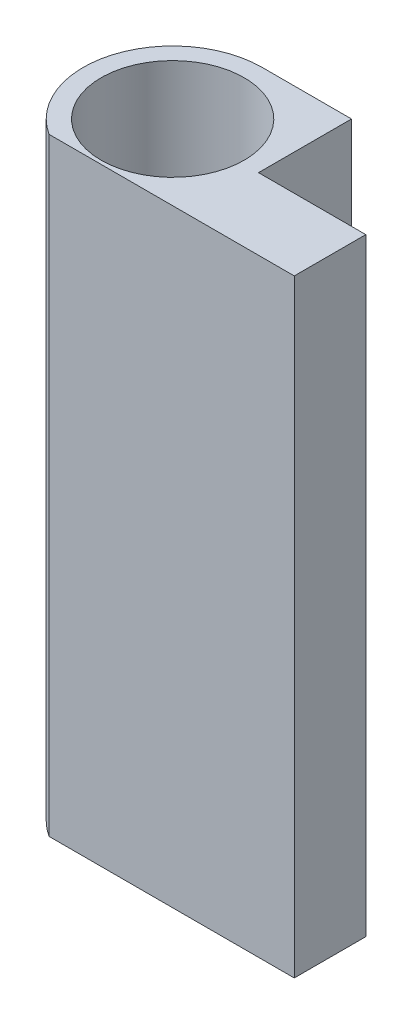
ISO-10303-21;
HEADER;
FILE_DESCRIPTION(('STEP AP214'),'2;1');
FILE_NAME('part.step','',(''),(''),'','','');
FILE_SCHEMA(('AUTOMOTIVE_DESIGN { 1 0 10303 214 1 1 1 1 }'));
ENDSEC;
DATA;
#1=APPLICATION_CONTEXT('core data for automotive mechanical design processes');
#2=APPLICATION_PROTOCOL_DEFINITION('international standard','automotive_design',2000,#1);
#3=PRODUCT_CONTEXT('',#1,'mechanical');
#4=PRODUCT('Part','Part','',(#3));
#5=PRODUCT_RELATED_PRODUCT_CATEGORY('part','',(#4));
#6=PRODUCT_DEFINITION_FORMATION('','',#4);
#7=PRODUCT_DEFINITION_CONTEXT('part definition',#1,'design');
#8=PRODUCT_DEFINITION('design','',#6,#7);
#9=PRODUCT_DEFINITION_SHAPE('','',#8);
#10=(LENGTH_UNIT() NAMED_UNIT(*) SI_UNIT(.MILLI.,.METRE.));
#11=(NAMED_UNIT(*) PLANE_ANGLE_UNIT() SI_UNIT($,.RADIAN.));
#12=(NAMED_UNIT(*) SI_UNIT($,.STERADIAN.) SOLID_ANGLE_UNIT());
#13=UNCERTAINTY_MEASURE_WITH_UNIT(LENGTH_MEASURE(1.E-05),#10,'distance_accuracy_value','');
#14=(GEOMETRIC_REPRESENTATION_CONTEXT(3) GLOBAL_UNCERTAINTY_ASSIGNED_CONTEXT((#13)) GLOBAL_UNIT_ASSIGNED_CONTEXT((#10,
#11,#12)) REPRESENTATION_CONTEXT('',''));
#15=CARTESIAN_POINT('',(0.,0.,0.));
#16=DIRECTION('',(0.,0.,1.));
#17=DIRECTION('',(1.,0.,0.));
#18=AXIS2_PLACEMENT_3D('',#15,#16,#17);
#19=CARTESIAN_POINT('',(0.,-10.,10.));
#20=DIRECTION('',(0.,0.,-1.));
#21=DIRECTION('',(-1.,0.,0.));
#22=AXIS2_PLACEMENT_3D('',#19,#20,#21);
#23=PLANE('',#22);
#24=DIRECTION('',(-1.,0.,0.));
#25=VECTOR('',#24,1.);
#26=CARTESIAN_POINT('',(0.,7.,10.));
#27=LINE('',#26,#25);
#28=CARTESIAN_POINT('',(10.,7.,10.));
#29=VERTEX_POINT('',#28);
#30=CARTESIAN_POINT('',(7.5,7.,10.));
#31=VERTEX_POINT('',#30);
#32=EDGE_CURVE('E82',#29,#31,#27,.T.);
#33=ORIENTED_EDGE('',*,*,#32,.F.);
#34=DIRECTION('',(0.,1.,0.));
#35=VECTOR('',#34,1.);
#36=CARTESIAN_POINT('',(10.,-10.,10.));
#37=LINE('',#36,#35);
#38=CARTESIAN_POINT('',(10.,-10.,10.));
#39=VERTEX_POINT('',#38);
#40=EDGE_CURVE('E11',#39,#29,#37,.T.);
#41=ORIENTED_EDGE('',*,*,#40,.F.);
#42=DIRECTION('',(-1.,0.,0.));
#43=VECTOR('',#42,1.);
#44=CARTESIAN_POINT('',(0.,-10.,10.));
#45=LINE('',#44,#43);
#46=CARTESIAN_POINT('',(7.5,-10.,10.));
#47=VERTEX_POINT('',#46);
#48=EDGE_CURVE('E101',#39,#47,#45,.T.);
#49=ORIENTED_EDGE('',*,*,#48,.T.);
#50=DIRECTION('',(0.,1.,0.));
#51=VECTOR('',#50,1.);
#52=CARTESIAN_POINT('',(7.5,-10.,10.));
#53=LINE('',#52,#51);
#54=EDGE_CURVE('E42',#47,#31,#53,.T.);
#55=ORIENTED_EDGE('',*,*,#54,.T.);
#56=EDGE_LOOP('',(#33,#41,#49,#55));
#57=FACE_BOUND('',#56,.T.);
#58=ADVANCED_FACE('F39',(#57),#23,.T.);
#59=CARTESIAN_POINT('',(7.5,-10.,12.5));
#60=DIRECTION('',(0.,1.,0.));
#61=DIRECTION('',(0.,0.,1.));
#62=AXIS2_PLACEMENT_3D('',#59,#60,#61);
#63=CYLINDRICAL_SURFACE('',#62,2.);
#64=CARTESIAN_POINT('',(7.5,-10.,12.5));
#65=DIRECTION('',(0.,1.,0.));
#66=DIRECTION('',(0.,0.,1.));
#67=AXIS2_PLACEMENT_3D('',#64,#65,#66);
#68=CIRCLE('',#67,2.);
#69=CARTESIAN_POINT('',(7.5,-10.,14.5));
#70=VERTEX_POINT('',#69);
#71=EDGE_CURVE('E97',#70,#70,#68,.T.);
#72=ORIENTED_EDGE('',*,*,#71,.F.);
#73=EDGE_LOOP('',(#72));
#74=FACE_BOUND('',#73,.T.);
#75=CARTESIAN_POINT('',(7.5,7.,12.5));
#76=DIRECTION('',(0.,1.,0.));
#77=DIRECTION('',(0.,0.,1.));
#78=AXIS2_PLACEMENT_3D('',#75,#76,#77);
#79=CIRCLE('',#78,2.);
#80=CARTESIAN_POINT('',(7.5,7.,14.5));
#81=VERTEX_POINT('',#80);
#82=EDGE_CURVE('E86',#81,#81,#79,.T.);
#83=ORIENTED_EDGE('',*,*,#82,.T.);
#84=EDGE_LOOP('',(#83));
#85=FACE_BOUND('',#84,.T.);
#86=ADVANCED_FACE('F117',(#74,#85),#63,.F.);
#87=CARTESIAN_POINT('',(7.5,-10.,12.5));
#88=DIRECTION('',(0.,1.,0.));
#89=DIRECTION('',(0.,0.,1.));
#90=AXIS2_PLACEMENT_3D('',#87,#88,#89);
#91=CYLINDRICAL_SURFACE('',#90,2.5);
#92=DIRECTION('',(0.,1.,0.));
#93=VECTOR('',#92,1.);
#94=CARTESIAN_POINT('',(6.14353400337495,-10.,14.6));
#95=LINE('',#94,#93);
#96=CARTESIAN_POINT('',(6.14353400337495,7.,14.6));
#97=VERTEX_POINT('',#96);
#98=CARTESIAN_POINT('',(6.14353400337495,-10.,14.6));
#99=VERTEX_POINT('',#98);
#100=EDGE_CURVE('E90',#97,#99,#95,.F.);
#101=ORIENTED_EDGE('',*,*,#100,.F.);
#102=CARTESIAN_POINT('',(7.5,7.,12.5));
#103=DIRECTION('',(0.,1.,0.));
#104=DIRECTION('',(0.,0.,1.));
#105=AXIS2_PLACEMENT_3D('',#102,#103,#104);
#106=CIRCLE('',#105,2.5);
#107=EDGE_CURVE('E87',#31,#97,#106,.T.);
#108=ORIENTED_EDGE('',*,*,#107,.F.);
#109=ORIENTED_EDGE('',*,*,#54,.F.);
#110=CARTESIAN_POINT('',(7.5,-10.,12.5));
#111=DIRECTION('',(0.,1.,0.));
#112=DIRECTION('',(0.,0.,1.));
#113=AXIS2_PLACEMENT_3D('',#110,#111,#112);
#114=CIRCLE('',#113,2.5);
#115=EDGE_CURVE('E104',#47,#99,#114,.T.);
#116=ORIENTED_EDGE('',*,*,#115,.T.);
#117=EDGE_LOOP('',(#101,#108,#109,#116));
#118=FACE_BOUND('',#117,.T.);
#119=ADVANCED_FACE('F119',(#118),#91,.T.);
#120=CARTESIAN_POINT('',(10.,-10.,0.));
#121=DIRECTION('',(-1.,0.,0.));
#122=DIRECTION('',(0.,0.,1.));
#123=AXIS2_PLACEMENT_3D('',#120,#121,#122);
#124=PLANE('',#123);
#125=DIRECTION('',(0.,1.,0.));
#126=VECTOR('',#125,1.);
#127=CARTESIAN_POINT('',(10.,7.,12.6));
#128=LINE('',#127,#126);
#129=CARTESIAN_POINT('',(10.,-10.,12.6));
#130=VERTEX_POINT('',#129);
#131=CARTESIAN_POINT('',(10.,7.,12.6));
#132=VERTEX_POINT('',#131);
#133=EDGE_CURVE('E53',#130,#132,#128,.T.);
#134=ORIENTED_EDGE('',*,*,#133,.F.);
#135=DIRECTION('',(0.,0.,1.));
#136=VECTOR('',#135,1.);
#137=CARTESIAN_POINT('',(10.,-10.,0.));
#138=LINE('',#137,#136);
#139=EDGE_CURVE('E73',#39,#130,#138,.T.);
#140=ORIENTED_EDGE('',*,*,#139,.F.);
#141=ORIENTED_EDGE('',*,*,#40,.T.);
#142=DIRECTION('',(0.,0.,1.));
#143=VECTOR('',#142,1.);
#144=CARTESIAN_POINT('',(10.,7.,0.));
#145=LINE('',#144,#143);
#146=EDGE_CURVE('E72',#29,#132,#145,.T.);
#147=ORIENTED_EDGE('',*,*,#146,.T.);
#148=EDGE_LOOP('',(#134,#140,#141,#147));
#149=FACE_BOUND('',#148,.T.);
#150=ADVANCED_FACE('F70',(#149),#124,.F.);
#151=CARTESIAN_POINT('',(13.,7.,12.6));
#152=DIRECTION('',(0.,0.,1.));
#153=DIRECTION('',(0.,-1.,0.));
#154=AXIS2_PLACEMENT_3D('',#151,#152,#153);
#155=PLANE('',#154);
#156=ORIENTED_EDGE('',*,*,#133,.T.);
#157=DIRECTION('',(-1.,0.,0.));
#158=VECTOR('',#157,1.);
#159=CARTESIAN_POINT('',(13.,7.,12.6));
#160=LINE('',#159,#158);
#161=CARTESIAN_POINT('',(13.,7.,12.6));
#162=VERTEX_POINT('',#161);
#163=EDGE_CURVE('E85',#162,#132,#160,.T.);
#164=ORIENTED_EDGE('',*,*,#163,.F.);
#165=DIRECTION('',(0.,1.,0.));
#166=VECTOR('',#165,1.);
#167=CARTESIAN_POINT('',(13.,7.,12.6));
#168=LINE('',#167,#166);
#169=CARTESIAN_POINT('',(13.,-10.,12.6));
#170=VERTEX_POINT('',#169);
#171=EDGE_CURVE('E252',#170,#162,#168,.T.);
#172=ORIENTED_EDGE('',*,*,#171,.F.);
#173=DIRECTION('',(-1.,0.,0.));
#174=VECTOR('',#173,1.);
#175=CARTESIAN_POINT('',(13.,-10.,12.6));
#176=LINE('',#175,#174);
#177=EDGE_CURVE('E255',#170,#130,#176,.T.);
#178=ORIENTED_EDGE('',*,*,#177,.T.);
#179=EDGE_LOOP('',(#156,#164,#172,#178));
#180=FACE_BOUND('',#179,.T.);
#181=ADVANCED_FACE('F133',(#180),#155,.F.);
#182=CARTESIAN_POINT('',(13.,0.,0.));
#183=DIRECTION('',(1.,0.,0.));
#184=DIRECTION('',(0.,0.,-1.));
#185=AXIS2_PLACEMENT_3D('',#182,#183,#184);
#186=PLANE('',#185);
#187=DIRECTION('',(0.,-1.,0.));
#188=VECTOR('',#187,1.);
#189=CARTESIAN_POINT('',(13.,7.,14.6));
#190=LINE('',#189,#188);
#191=CARTESIAN_POINT('',(13.,7.,14.6));
#192=VERTEX_POINT('',#191);
#193=CARTESIAN_POINT('',(13.,-10.,14.6));
#194=VERTEX_POINT('',#193);
#195=EDGE_CURVE('E253',#192,#194,#190,.T.);
#196=ORIENTED_EDGE('',*,*,#195,.T.);
#197=DIRECTION('',(0.,0.,-1.));
#198=VECTOR('',#197,1.);
#199=CARTESIAN_POINT('',(13.,-10.,14.6));
#200=LINE('',#199,#198);
#201=EDGE_CURVE('E237',#194,#170,#200,.T.);
#202=ORIENTED_EDGE('',*,*,#201,.T.);
#203=ORIENTED_EDGE('',*,*,#171,.T.);
#204=DIRECTION('',(0.,0.,1.));
#205=VECTOR('',#204,1.);
#206=CARTESIAN_POINT('',(13.,7.,14.6));
#207=LINE('',#206,#205);
#208=EDGE_CURVE('E257',#162,#192,#207,.T.);
#209=ORIENTED_EDGE('',*,*,#208,.T.);
#210=EDGE_LOOP('',(#196,#202,#203,#209));
#211=FACE_BOUND('',#210,.T.);
#212=ADVANCED_FACE('F138',(#211),#186,.T.);
#213=CARTESIAN_POINT('',(-10.,-10.,14.6));
#214=DIRECTION('',(0.,0.,-1.));
#215=DIRECTION('',(-1.,0.,0.));
#216=AXIS2_PLACEMENT_3D('',#213,#214,#215);
#217=PLANE('',#216);
#218=ORIENTED_EDGE('',*,*,#100,.T.);
#219=DIRECTION('',(-1.,0.,0.));
#220=VECTOR('',#219,1.);
#221=CARTESIAN_POINT('',(-10.,-10.,14.6));
#222=LINE('',#221,#220);
#223=EDGE_CURVE('E94',#194,#99,#222,.T.);
#224=ORIENTED_EDGE('',*,*,#223,.F.);
#225=ORIENTED_EDGE('',*,*,#195,.F.);
#226=DIRECTION('',(-1.,0.,0.));
#227=VECTOR('',#226,1.);
#228=CARTESIAN_POINT('',(-10.,7.,14.6));
#229=LINE('',#228,#227);
#230=EDGE_CURVE('E234',#192,#97,#229,.T.);
#231=ORIENTED_EDGE('',*,*,#230,.T.);
#232=EDGE_LOOP('',(#218,#224,#225,#231));
#233=FACE_BOUND('',#232,.T.);
#234=ADVANCED_FACE('F145',(#233),#217,.F.);
#235=CARTESIAN_POINT('',(0.,7.,0.));
#236=DIRECTION('',(0.,1.,0.));
#237=DIRECTION('',(0.,0.,1.));
#238=AXIS2_PLACEMENT_3D('',#235,#236,#237);
#239=PLANE('',#238);
#240=ORIENTED_EDGE('',*,*,#230,.F.);
#241=ORIENTED_EDGE('',*,*,#208,.F.);
#242=ORIENTED_EDGE('',*,*,#163,.T.);
#243=ORIENTED_EDGE('',*,*,#146,.F.);
#244=ORIENTED_EDGE('',*,*,#32,.T.);
#245=ORIENTED_EDGE('',*,*,#107,.T.);
#246=EDGE_LOOP('',(#240,#241,#242,#243,#244,#245));
#247=FACE_BOUND('',#246,.T.);
#248=ORIENTED_EDGE('',*,*,#82,.F.);
#249=EDGE_LOOP('',(#248));
#250=FACE_BOUND('',#249,.T.);
#251=ADVANCED_FACE('F79',(#247,#250),#239,.T.);
#252=CARTESIAN_POINT('',(0.,-10.,0.));
#253=DIRECTION('',(0.,1.,0.));
#254=DIRECTION('',(0.,0.,1.));
#255=AXIS2_PLACEMENT_3D('',#252,#253,#254);
#256=PLANE('',#255);
#257=ORIENTED_EDGE('',*,*,#139,.T.);
#258=ORIENTED_EDGE('',*,*,#177,.F.);
#259=ORIENTED_EDGE('',*,*,#201,.F.);
#260=ORIENTED_EDGE('',*,*,#223,.T.);
#261=ORIENTED_EDGE('',*,*,#115,.F.);
#262=ORIENTED_EDGE('',*,*,#48,.F.);
#263=EDGE_LOOP('',(#257,#258,#259,#260,#261,#262));
#264=FACE_BOUND('',#263,.T.);
#265=ORIENTED_EDGE('',*,*,#71,.T.);
#266=EDGE_LOOP('',(#265));
#267=FACE_BOUND('',#266,.T.);
#268=ADVANCED_FACE('F115',(#264,#267),#256,.F.);
#269=CLOSED_SHELL('',(#58,#86,#119,#150,#181,#212,#234,#251,#268));
#270=MANIFOLD_SOLID_BREP('B2',#269);
#271=ADVANCED_BREP_SHAPE_REPRESENTATION('',(#18,#270),#14);
#272=SHAPE_DEFINITION_REPRESENTATION(#9,#271);
ENDSEC;
END-ISO-10303-21;
